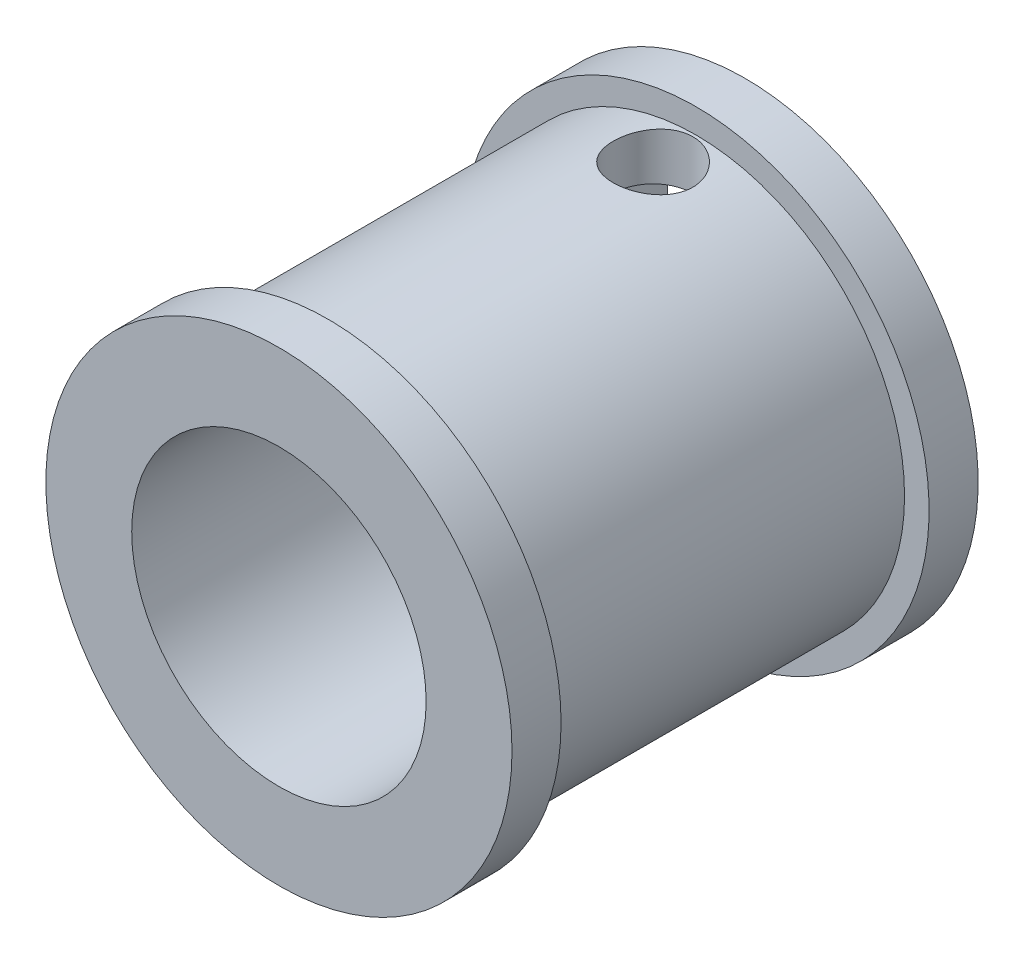
ISO-10303-21;
HEADER;
FILE_DESCRIPTION(('STEP AP214'),'2;1');
FILE_NAME('part.step','',(''),(''),'','','');
FILE_SCHEMA(('AUTOMOTIVE_DESIGN { 1 0 10303 214 1 1 1 1 }'));
ENDSEC;
DATA;
#1=APPLICATION_CONTEXT('core data for automotive mechanical design processes');
#2=APPLICATION_PROTOCOL_DEFINITION('international standard','automotive_design',2000,#1);
#3=PRODUCT_CONTEXT('',#1,'mechanical');
#4=PRODUCT('Part','Part','',(#3));
#5=PRODUCT_RELATED_PRODUCT_CATEGORY('part','',(#4));
#6=PRODUCT_DEFINITION_FORMATION('','',#4);
#7=PRODUCT_DEFINITION_CONTEXT('part definition',#1,'design');
#8=PRODUCT_DEFINITION('design','',#6,#7);
#9=PRODUCT_DEFINITION_SHAPE('','',#8);
#10=(LENGTH_UNIT() NAMED_UNIT(*) SI_UNIT(.MILLI.,.METRE.));
#11=(NAMED_UNIT(*) PLANE_ANGLE_UNIT() SI_UNIT($,.RADIAN.));
#12=(NAMED_UNIT(*) SI_UNIT($,.STERADIAN.) SOLID_ANGLE_UNIT());
#13=UNCERTAINTY_MEASURE_WITH_UNIT(LENGTH_MEASURE(1.E-05),#10,'distance_accuracy_value','');
#14=(GEOMETRIC_REPRESENTATION_CONTEXT(3) GLOBAL_UNCERTAINTY_ASSIGNED_CONTEXT((#13)) GLOBAL_UNIT_ASSIGNED_CONTEXT((#10,
#11,#12)) REPRESENTATION_CONTEXT('',''));
#15=CARTESIAN_POINT('',(0.,0.,0.));
#16=DIRECTION('',(0.,0.,1.));
#17=DIRECTION('',(1.,0.,0.));
#18=AXIS2_PLACEMENT_3D('',#15,#16,#17);
#19=CARTESIAN_POINT('',(0.,0.,19.));
#20=DIRECTION('',(0.,0.,-1.));
#21=DIRECTION('',(-1.,0.,0.));
#22=AXIS2_PLACEMENT_3D('',#19,#20,#21);
#23=CYLINDRICAL_SURFACE('',#22,1.625);
#24=CARTESIAN_POINT('',(0.,0.,3.75));
#25=DIRECTION('',(0.,-0.707106781186547,-0.707106781186547));
#26=DIRECTION('',(0.,0.707106781186547,-0.707106781186547));
#27=AXIS2_PLACEMENT_3D('',#24,#25,#26);
#28=ELLIPSE('',#27,2.29809703885628,1.625);
#29=CARTESIAN_POINT('',(-1.625,0.,3.75));
#30=VERTEX_POINT('',#29);
#31=CARTESIAN_POINT('',(-1.61264534228701,-0.2,3.95));
#32=VERTEX_POINT('',#31);
#33=EDGE_CURVE('E114',#30,#32,#28,.F.);
#34=ORIENTED_EDGE('',*,*,#33,.F.);
#35=CARTESIAN_POINT('',(0.,0.,3.75));
#36=DIRECTION('',(0.,0.707106781186547,-0.707106781186547));
#37=DIRECTION('',(0.,-0.707106781186547,-0.707106781186547));
#38=AXIS2_PLACEMENT_3D('',#35,#36,#37);
#39=ELLIPSE('',#38,2.29809703885628,1.625);
#40=CARTESIAN_POINT('',(1.625,0.,3.75));
#41=VERTEX_POINT('',#40);
#42=EDGE_CURVE('E110',#41,#30,#39,.F.);
#43=ORIENTED_EDGE('',*,*,#42,.F.);
#44=CARTESIAN_POINT('',(1.61264534228701,-0.2,3.95));
#45=VERTEX_POINT('',#44);
#46=EDGE_CURVE('E102',#45,#41,#28,.F.);
#47=ORIENTED_EDGE('',*,*,#46,.F.);
#48=DIRECTION('',(0.,0.,-1.));
#49=VECTOR('',#48,1.);
#50=CARTESIAN_POINT('',(1.61264534228701,-0.2,19.));
#51=LINE('',#50,#49);
#52=CARTESIAN_POINT('',(1.61264534228701,-0.2,3.55));
#53=VERTEX_POINT('',#52);
#54=EDGE_CURVE('E43',#45,#53,#51,.T.);
#55=ORIENTED_EDGE('',*,*,#54,.T.);
#56=CARTESIAN_POINT('',(0.,0.,3.75));
#57=DIRECTION('',(0.,0.707106781186547,-0.707106781186547));
#58=DIRECTION('',(0.,-0.707106781186547,-0.707106781186547));
#59=AXIS2_PLACEMENT_3D('',#56,#57,#58);
#60=ELLIPSE('',#59,2.29809703885628,1.625);
#61=EDGE_CURVE('E104',#41,#53,#60,.T.);
#62=ORIENTED_EDGE('',*,*,#61,.F.);
#63=CARTESIAN_POINT('',(0.,0.,3.75));
#64=DIRECTION('',(0.,-0.707106781186547,-0.707106781186547));
#65=DIRECTION('',(0.,0.707106781186547,-0.707106781186547));
#66=AXIS2_PLACEMENT_3D('',#63,#64,#65);
#67=ELLIPSE('',#66,2.29809703885628,1.625);
#68=EDGE_CURVE('E111',#30,#41,#67,.T.);
#69=ORIENTED_EDGE('',*,*,#68,.F.);
#70=CARTESIAN_POINT('',(-1.61264534228701,-0.2,3.55));
#71=VERTEX_POINT('',#70);
#72=EDGE_CURVE('E50',#71,#30,#60,.T.);
#73=ORIENTED_EDGE('',*,*,#72,.F.);
#74=DIRECTION('',(0.,0.,-1.));
#75=VECTOR('',#74,1.);
#76=CARTESIAN_POINT('',(-1.61264534228701,-0.2,19.));
#77=LINE('',#76,#75);
#78=EDGE_CURVE('E11',#71,#32,#77,.F.);
#79=ORIENTED_EDGE('',*,*,#78,.T.);
#80=EDGE_LOOP('',(#34,#43,#47,#55,#62,#69,#73,#79));
#81=FACE_BOUND('',#80,.T.);
#82=CARTESIAN_POINT('',(0.,0.,0.));
#83=DIRECTION('',(0.,0.,1.));
#84=DIRECTION('',(1.,0.,0.));
#85=AXIS2_PLACEMENT_3D('',#82,#83,#84);
#86=CIRCLE('',#85,1.625);
#87=CARTESIAN_POINT('',(1.625,0.,0.));
#88=VERTEX_POINT('',#87);
#89=EDGE_CURVE('E200',#88,#88,#86,.T.);
#90=ORIENTED_EDGE('',*,*,#89,.F.);
#91=EDGE_LOOP('',(#90));
#92=FACE_BOUND('',#91,.T.);
#93=CARTESIAN_POINT('',(0.,0.,10.));
#94=DIRECTION('',(0.,0.,1.));
#95=DIRECTION('',(1.,0.,0.));
#96=AXIS2_PLACEMENT_3D('',#93,#94,#95);
#97=CIRCLE('',#96,1.625);
#98=CARTESIAN_POINT('',(1.625,0.,10.));
#99=VERTEX_POINT('',#98);
#100=EDGE_CURVE('E38',#99,#99,#97,.F.);
#101=ORIENTED_EDGE('',*,*,#100,.F.);
#102=EDGE_LOOP('',(#101));
#103=FACE_BOUND('',#102,.T.);
#104=ADVANCED_FACE('F33',(#81,#92,#103),#23,.F.);
#105=CARTESIAN_POINT('',(0.,0.,19.));
#106=DIRECTION('',(0.,0.,-1.));
#107=DIRECTION('',(-1.,0.,0.));
#108=AXIS2_PLACEMENT_3D('',#105,#106,#107);
#109=CYLINDRICAL_SURFACE('',#108,8.5);
#110=CARTESIAN_POINT('',(0.,0.,2.));
#111=DIRECTION('',(0.,0.,-1.));
#112=DIRECTION('',(-1.,0.,0.));
#113=AXIS2_PLACEMENT_3D('',#110,#111,#112);
#114=CIRCLE('',#113,8.5);
#115=CARTESIAN_POINT('',(-8.5,0.,2.));
#116=VERTEX_POINT('',#115);
#117=EDGE_CURVE('E242',#116,#116,#114,.T.);
#118=ORIENTED_EDGE('',*,*,#117,.F.);
#119=EDGE_LOOP('',(#118));
#120=FACE_BOUND('',#119,.T.);
#121=CARTESIAN_POINT('',(0.,0.,17.));
#122=DIRECTION('',(0.,0.,1.));
#123=DIRECTION('',(1.,0.,0.));
#124=AXIS2_PLACEMENT_3D('',#121,#122,#123);
#125=CIRCLE('',#124,8.5);
#126=CARTESIAN_POINT('',(8.5,0.,17.));
#127=VERTEX_POINT('',#126);
#128=EDGE_CURVE('E97',#127,#127,#125,.T.);
#129=ORIENTED_EDGE('',*,*,#128,.F.);
#130=EDGE_LOOP('',(#129));
#131=FACE_BOUND('',#130,.T.);
#132=CARTESIAN_POINT('',(0.,8.5,5.375));
#133=CARTESIAN_POINT('',(0.0903945572538876,8.49999835243109,5.37499658149126));
#134=CARTESIAN_POINT('',(0.18083322350035,8.49854316497424,5.36743188876263));
#135=CARTESIAN_POINT('',(0.359159795109496,8.49287842275933,5.33739377851433));
#136=CARTESIAN_POINT('',(0.447045520844813,8.48866658268262,5.31490799090195));
#137=CARTESIAN_POINT('',(0.61766163173839,8.47795944255546,5.25574319233837));
#138=CARTESIAN_POINT('',(0.700396673362368,8.47146624131938,5.21907722380532));
#139=CARTESIAN_POINT('',(0.858533605572363,8.45690451266456,5.13263040235962));
#140=CARTESIAN_POINT('',(0.933936043768956,8.44883610302048,5.08285052984576));
#141=CARTESIAN_POINT('',(1.0762115101766,8.43190166548817,4.97093250788181));
#142=CARTESIAN_POINT('',(1.14298024738396,8.42302775850568,4.90866295749279));
#143=CARTESIAN_POINT('',(1.265190534391,8.40554061471071,4.77381579060993));
#144=CARTESIAN_POINT('',(1.32063125056873,8.3969273971219,4.70123741616192));
#145=CARTESIAN_POINT('',(1.41904843072196,8.3808601674157,4.5470920108507));
#146=CARTESIAN_POINT('',(1.4619182579635,8.37341630821173,4.46545574409331));
#147=CARTESIAN_POINT('',(1.53329395239523,8.36064189133733,4.29597353068678));
#148=CARTESIAN_POINT('',(1.56180110980798,8.35531114385172,4.20812814262207));
#149=CARTESIAN_POINT('',(1.60330642854418,8.34744594074392,4.02983899567812));
#150=CARTESIAN_POINT('',(1.61648678881636,8.34487866196381,3.93943912923692));
#151=CARTESIAN_POINT('',(1.62753001967958,8.3427321608315,3.75767745170205));
#152=CARTESIAN_POINT('',(1.62539431903934,8.34315265976247,3.66631573112951));
#153=CARTESIAN_POINT('',(1.60601366876019,8.34690433687137,3.48654750599075));
#154=CARTESIAN_POINT('',(1.58897638350366,8.35019550841473,3.39811765472527));
#155=CARTESIAN_POINT('',(1.54060344594839,8.35925481483431,3.22539498587627));
#156=CARTESIAN_POINT('',(1.50926716430382,8.36502305873398,3.1411023505661));
#157=CARTESIAN_POINT('',(1.43298405267585,8.37842813084279,2.97844189309478));
#158=CARTESIAN_POINT('',(1.38795381514222,8.38607635335706,2.90011416452897));
#159=CARTESIAN_POINT('',(1.2856199831973,8.40237214993443,2.75204841155908));
#160=CARTESIAN_POINT('',(1.22831509557011,8.4110198292527,2.68231129345321));
#161=CARTESIAN_POINT('',(1.10194123988146,8.42851419579409,2.55220695777682));
#162=CARTESIAN_POINT('',(1.03269475902188,8.43736182091324,2.49201215670377));
#163=CARTESIAN_POINT('',(0.88499618103328,8.45412897950981,2.38406683487531));
#164=CARTESIAN_POINT('',(0.806543984550195,8.46204850296872,2.33631644844601));
#165=CARTESIAN_POINT('',(0.642477737724025,8.47608409888518,2.25458814921088));
#166=CARTESIAN_POINT('',(0.556854280078011,8.48219775328289,2.22062867986473));
#167=CARTESIAN_POINT('',(0.38097510574662,8.49191418361371,2.16762325135386));
#168=CARTESIAN_POINT('',(0.290719902135103,8.49551723701261,2.14857564413613));
#169=CARTESIAN_POINT('',(0.109622114135444,8.49976823391624,2.1261758014087));
#170=CARTESIAN_POINT('',(0.018809749828459,8.50046063654033,2.12258741077682));
#171=CARTESIAN_POINT('',(-0.162117246503742,8.49893532218348,2.13057367090997));
#172=CARTESIAN_POINT('',(-0.25223191398799,8.49671775408556,2.14214754592698));
#173=CARTESIAN_POINT('',(-0.428452755980503,8.48964939137328,2.17993349679757));
#174=CARTESIAN_POINT('',(-0.514585598146657,8.48482018812363,2.20602559546225));
#175=CARTESIAN_POINT('',(-0.681254067551567,8.47306787307943,2.2719771354861));
#176=CARTESIAN_POINT('',(-0.761789302684263,8.46614461478012,2.31183754013441));
#177=CARTESIAN_POINT('',(-0.915980891342013,8.45086126981745,2.40471348330283));
#178=CARTESIAN_POINT('',(-0.989549140397992,8.44248581784409,2.45787271121178));
#179=CARTESIAN_POINT('',(-1.12680563036966,8.42526573618666,2.5756434586076));
#180=CARTESIAN_POINT('',(-1.19049290845354,8.4164210608926,2.64025609283648));
#181=CARTESIAN_POINT('',(-1.30708102478181,8.399111203794,2.78017039825303));
#182=CARTESIAN_POINT('',(-1.35982041980168,8.3906529663421,2.85560760098976));
#183=CARTESIAN_POINT('',(-1.45187917952133,8.37521549819557,3.01440915883489));
#184=CARTESIAN_POINT('',(-1.49119905477389,8.36823621123733,3.09777321220771));
#185=CARTESIAN_POINT('',(-1.55507616817908,8.35660182144951,3.2696600189125));
#186=CARTESIAN_POINT('',(-1.57970620665021,8.35193527686773,3.35815490709934));
#187=CARTESIAN_POINT('',(-1.61372797970122,8.34542912956261,3.53812487793951));
#188=CARTESIAN_POINT('',(-1.62312150978107,8.3435891937475,3.62959960814628));
#189=CARTESIAN_POINT('',(-1.62634169273169,8.34296194602857,3.81131443308119));
#190=CARTESIAN_POINT('',(-1.62042313014401,8.34412467096553,3.90154993808799));
#191=CARTESIAN_POINT('',(-1.59374624145851,8.34926070378568,4.07971428316511));
#192=CARTESIAN_POINT('',(-1.57298801248506,8.35323399327397,4.16764313832837));
#193=CARTESIAN_POINT('',(-1.51733033383493,8.36352204818264,4.33855393284873));
#194=CARTESIAN_POINT('',(-1.4824595280227,8.36983206862051,4.4215455042208));
#195=CARTESIAN_POINT('',(-1.39959479949044,8.38408576757389,4.58054066291797));
#196=CARTESIAN_POINT('',(-1.35159989918565,8.39202956777509,4.656543729121));
#197=CARTESIAN_POINT('',(-1.2429680791682,8.40881021672979,4.80067852256959));
#198=CARTESIAN_POINT('',(-1.18214614064919,8.41765903391513,4.86866943540694));
#199=CARTESIAN_POINT('',(-1.04997148708861,8.4351641981668,4.99356486630231));
#200=CARTESIAN_POINT('',(-0.978616356463049,8.44382050055824,5.05046683436179));
#201=CARTESIAN_POINT('',(-0.826595057873993,8.46006107011932,5.15207132625573));
#202=CARTESIAN_POINT('',(-0.745847538817393,8.46763447478637,5.19665392716147));
#203=CARTESIAN_POINT('',(-0.577888066767615,8.48074963995798,5.27154823399553));
#204=CARTESIAN_POINT('',(-0.490682202958104,8.48629328560504,5.30187318921524));
#205=CARTESIAN_POINT('',(-0.336030835981106,8.49360936379373,5.34131559546969));
#206=CARTESIAN_POINT('',(-0.269482836608206,8.49599217795871,5.35392539301356));
#207=CARTESIAN_POINT('',(-0.135298109376888,8.49918809133807,5.37076876082237));
#208=CARTESIAN_POINT('',(-0.067661411165921,8.50000123322511,5.37500255879483));
#209=CARTESIAN_POINT('',(0.,8.5,5.375));
#210=B_SPLINE_CURVE_WITH_KNOTS('',3,(#132,#133,#134,#135,#136,#137,#138,#139,#140,#141,#142,
#143,#144,#145,#146,#147,#148,#149,#150,#151,#152,#153,#154,#155,#156,#157,#158,#159,#160,#161,
#162,#163,#164,#165,#166,#167,#168,#169,#170,#171,#172,#173,#174,#175,#176,#177,#178,#179,#180,
#181,#182,#183,#184,#185,#186,#187,#188,#189,#190,#191,#192,#193,#194,#195,#196,#197,#198,#199,
#200,#201,#202,#203,#204,#205,#206,#207,#208,#209),.UNSPECIFIED.,.T.,.F.,(4,2,2,2,2,2,2,2,2,2,2,
2,2,2,2,2,2,2,2,2,2,2,2,2,2,2,2,2,2,2,2,2,2,2,2,2,2,2,4),(0.,0.270936205781262,
0.542097307937282,0.813009596787944,1.08390163791212,1.35780918645762,1.63173688443393,
1.9079251660624,2.1840886328117,2.45693448620097,2.72975488731821,2.99883284967365,
3.26792265617709,3.53868543374998,3.80947675202337,4.08470890002385,4.35994401878148,
4.63554602407514,4.91111756564415,5.18246420466136,5.45379696129436,5.7229200562965,
5.99206198410815,6.26424798646523,6.53646049481757,6.8124395539943,7.08840811222947,
7.36299740133278,7.63755432994534,7.90757227899994,8.1775884608257,8.44705932581407,
8.71655026856117,8.99023277903381,9.26397815108827,9.54030127403387,9.81636710644622,
10.0191716221483,10.2219706243892),.UNSPECIFIED.);
#211=CARTESIAN_POINT('',(0.,8.5,5.375));
#212=VERTEX_POINT('',#211);
#213=EDGE_CURVE('E121',#212,#212,#210,.T.);
#214=ORIENTED_EDGE('',*,*,#213,.F.);
#215=EDGE_LOOP('',(#214));
#216=FACE_BOUND('',#215,.T.);
#217=ADVANCED_FACE('F35',(#120,#131,#216),#109,.T.);
#218=CARTESIAN_POINT('',(0.,0.,19.));
#219=DIRECTION('',(0.,0.,1.));
#220=DIRECTION('',(1.,0.,0.));
#221=AXIS2_PLACEMENT_3D('',#218,#219,#220);
#222=PLANE('',#221);
#223=CARTESIAN_POINT('',(0.,0.,19.));
#224=DIRECTION('',(0.,0.,1.));
#225=DIRECTION('',(1.,0.,0.));
#226=AXIS2_PLACEMENT_3D('',#223,#224,#225);
#227=CIRCLE('',#226,6.);
#228=CARTESIAN_POINT('',(6.,0.,19.));
#229=VERTEX_POINT('',#228);
#230=EDGE_CURVE('E311',#229,#229,#227,.T.);
#231=ORIENTED_EDGE('',*,*,#230,.F.);
#232=EDGE_LOOP('',(#231));
#233=FACE_BOUND('',#232,.T.);
#234=CARTESIAN_POINT('',(0.,0.,19.));
#235=DIRECTION('',(0.,0.,1.));
#236=DIRECTION('',(1.,0.,0.));
#237=AXIS2_PLACEMENT_3D('',#234,#235,#236);
#238=CIRCLE('',#237,9.5);
#239=CARTESIAN_POINT('',(9.5,0.,19.));
#240=VERTEX_POINT('',#239);
#241=EDGE_CURVE('E123',#240,#240,#238,.T.);
#242=ORIENTED_EDGE('',*,*,#241,.T.);
#243=EDGE_LOOP('',(#242));
#244=FACE_BOUND('',#243,.T.);
#245=ADVANCED_FACE('F184',(#233,#244),#222,.T.);
#246=CARTESIAN_POINT('',(0.,0.,0.));
#247=DIRECTION('',(0.,0.,1.));
#248=DIRECTION('',(1.,0.,0.));
#249=AXIS2_PLACEMENT_3D('',#246,#247,#248);
#250=PLANE('',#249);
#251=DIRECTION('',(1.,0.,0.));
#252=VECTOR('',#251,1.);
#253=CARTESIAN_POINT('',(3.17,6.5,0.));
#254=LINE('',#253,#252);
#255=CARTESIAN_POINT('',(-3.17,6.5,0.));
#256=VERTEX_POINT('',#255);
#257=CARTESIAN_POINT('',(3.17,6.5,0.));
#258=VERTEX_POINT('',#257);
#259=EDGE_CURVE('E196',#256,#258,#254,.T.);
#260=ORIENTED_EDGE('',*,*,#259,.F.);
#261=DIRECTION('',(0.,1.,0.));
#262=VECTOR('',#261,1.);
#263=CARTESIAN_POINT('',(-3.17,3.5,0.));
#264=LINE('',#263,#262);
#265=CARTESIAN_POINT('',(-3.17,3.5,0.));
#266=VERTEX_POINT('',#265);
#267=EDGE_CURVE('E208',#266,#256,#264,.T.);
#268=ORIENTED_EDGE('',*,*,#267,.F.);
#269=DIRECTION('',(-1.,0.,0.));
#270=VECTOR('',#269,1.);
#271=CARTESIAN_POINT('',(3.17,3.5,0.));
#272=LINE('',#271,#270);
#273=CARTESIAN_POINT('',(3.17,3.5,0.));
#274=VERTEX_POINT('',#273);
#275=EDGE_CURVE('E216',#274,#266,#272,.T.);
#276=ORIENTED_EDGE('',*,*,#275,.F.);
#277=DIRECTION('',(0.,-1.,0.));
#278=VECTOR('',#277,1.);
#279=CARTESIAN_POINT('',(3.17,3.5,0.));
#280=LINE('',#279,#278);
#281=EDGE_CURVE('E228',#258,#274,#280,.T.);
#282=ORIENTED_EDGE('',*,*,#281,.F.);
#283=EDGE_LOOP('',(#260,#268,#276,#282));
#284=FACE_BOUND('',#283,.T.);
#285=ORIENTED_EDGE('',*,*,#89,.T.);
#286=EDGE_LOOP('',(#285));
#287=FACE_BOUND('',#286,.T.);
#288=CARTESIAN_POINT('',(0.,0.,0.));
#289=DIRECTION('',(0.,0.,-1.));
#290=DIRECTION('',(-1.,0.,0.));
#291=AXIS2_PLACEMENT_3D('',#288,#289,#290);
#292=CIRCLE('',#291,9.5);
#293=CARTESIAN_POINT('',(-9.5,0.,0.));
#294=VERTEX_POINT('',#293);
#295=EDGE_CURVE('E203',#294,#294,#292,.T.);
#296=ORIENTED_EDGE('',*,*,#295,.T.);
#297=EDGE_LOOP('',(#296));
#298=FACE_BOUND('',#297,.T.);
#299=ADVANCED_FACE('F180',(#284,#287,#298),#250,.F.);
#300=CARTESIAN_POINT('',(-3.17,3.5,7.5));
#301=DIRECTION('',(-1.,0.,0.));
#302=DIRECTION('',(0.,0.,1.));
#303=AXIS2_PLACEMENT_3D('',#300,#301,#302);
#304=PLANE('',#303);
#305=ORIENTED_EDGE('',*,*,#267,.T.);
#306=DIRECTION('',(0.,0.,-1.));
#307=VECTOR('',#306,1.);
#308=CARTESIAN_POINT('',(-3.17,6.5,7.5));
#309=LINE('',#308,#307);
#310=CARTESIAN_POINT('',(-3.17,6.5,7.5));
#311=VERTEX_POINT('',#310);
#312=EDGE_CURVE('E225',#311,#256,#309,.T.);
#313=ORIENTED_EDGE('',*,*,#312,.F.);
#314=DIRECTION('',(0.,1.,0.));
#315=VECTOR('',#314,1.);
#316=CARTESIAN_POINT('',(-3.17,3.5,7.5));
#317=LINE('',#316,#315);
#318=CARTESIAN_POINT('',(-3.17,3.5,7.5));
#319=VERTEX_POINT('',#318);
#320=EDGE_CURVE('E212',#319,#311,#317,.T.);
#321=ORIENTED_EDGE('',*,*,#320,.F.);
#322=DIRECTION('',(0.,0.,-1.));
#323=VECTOR('',#322,1.);
#324=CARTESIAN_POINT('',(-3.17,3.5,7.5));
#325=LINE('',#324,#323);
#326=EDGE_CURVE('E233',#319,#266,#325,.T.);
#327=ORIENTED_EDGE('',*,*,#326,.T.);
#328=EDGE_LOOP('',(#305,#313,#321,#327));
#329=FACE_BOUND('',#328,.T.);
#330=ADVANCED_FACE('F170',(#329),#304,.F.);
#331=CARTESIAN_POINT('',(3.17,3.5,7.5));
#332=DIRECTION('',(0.,-1.,0.));
#333=DIRECTION('',(0.,0.,-1.));
#334=AXIS2_PLACEMENT_3D('',#331,#332,#333);
#335=PLANE('',#334);
#336=CARTESIAN_POINT('',(0.,3.5,3.75));
#337=DIRECTION('',(0.,-1.,0.));
#338=DIRECTION('',(0.,0.,-1.));
#339=AXIS2_PLACEMENT_3D('',#336,#337,#338);
#340=CIRCLE('',#339,1.625);
#341=CARTESIAN_POINT('',(0.,3.5,2.125));
#342=VERTEX_POINT('',#341);
#343=EDGE_CURVE('E112',#342,#342,#340,.F.);
#344=ORIENTED_EDGE('',*,*,#343,.F.);
#345=EDGE_LOOP('',(#344));
#346=FACE_BOUND('',#345,.T.);
#347=ORIENTED_EDGE('',*,*,#275,.T.);
#348=ORIENTED_EDGE('',*,*,#326,.F.);
#349=DIRECTION('',(-1.,0.,0.));
#350=VECTOR('',#349,1.);
#351=CARTESIAN_POINT('',(3.17,3.5,7.5));
#352=LINE('',#351,#350);
#353=CARTESIAN_POINT('',(3.17,3.5,7.5));
#354=VERTEX_POINT('',#353);
#355=EDGE_CURVE('E222',#354,#319,#352,.T.);
#356=ORIENTED_EDGE('',*,*,#355,.F.);
#357=DIRECTION('',(0.,0.,-1.));
#358=VECTOR('',#357,1.);
#359=CARTESIAN_POINT('',(3.17,3.5,7.5));
#360=LINE('',#359,#358);
#361=EDGE_CURVE('E235',#354,#274,#360,.T.);
#362=ORIENTED_EDGE('',*,*,#361,.T.);
#363=EDGE_LOOP('',(#347,#348,#356,#362));
#364=FACE_BOUND('',#363,.T.);
#365=ADVANCED_FACE('F166',(#346,#364),#335,.F.);
#366=CARTESIAN_POINT('',(3.17,3.5,7.5));
#367=DIRECTION('',(1.,0.,0.));
#368=DIRECTION('',(0.,0.,-1.));
#369=AXIS2_PLACEMENT_3D('',#366,#367,#368);
#370=PLANE('',#369);
#371=ORIENTED_EDGE('',*,*,#281,.T.);
#372=ORIENTED_EDGE('',*,*,#361,.F.);
#373=DIRECTION('',(0.,-1.,0.));
#374=VECTOR('',#373,1.);
#375=CARTESIAN_POINT('',(3.17,3.5,7.5));
#376=LINE('',#375,#374);
#377=CARTESIAN_POINT('',(3.17,6.5,7.5));
#378=VERTEX_POINT('',#377);
#379=EDGE_CURVE('E219',#378,#354,#376,.T.);
#380=ORIENTED_EDGE('',*,*,#379,.F.);
#381=DIRECTION('',(0.,0.,-1.));
#382=VECTOR('',#381,1.);
#383=CARTESIAN_POINT('',(3.17,6.5,7.5));
#384=LINE('',#383,#382);
#385=EDGE_CURVE('E237',#378,#258,#384,.T.);
#386=ORIENTED_EDGE('',*,*,#385,.T.);
#387=EDGE_LOOP('',(#371,#372,#380,#386));
#388=FACE_BOUND('',#387,.T.);
#389=ADVANCED_FACE('F169',(#388),#370,.F.);
#390=CARTESIAN_POINT('',(3.17,6.5,7.5));
#391=DIRECTION('',(0.,1.,0.));
#392=DIRECTION('',(0.,0.,1.));
#393=AXIS2_PLACEMENT_3D('',#390,#391,#392);
#394=PLANE('',#393);
#395=CARTESIAN_POINT('',(0.,6.5,3.75));
#396=DIRECTION('',(0.,1.,0.));
#397=DIRECTION('',(0.,0.,1.));
#398=AXIS2_PLACEMENT_3D('',#395,#396,#397);
#399=CIRCLE('',#398,1.625);
#400=CARTESIAN_POINT('',(0.,6.5,5.375));
#401=VERTEX_POINT('',#400);
#402=EDGE_CURVE('E105',#401,#401,#399,.F.);
#403=ORIENTED_EDGE('',*,*,#402,.F.);
#404=EDGE_LOOP('',(#403));
#405=FACE_BOUND('',#404,.T.);
#406=ORIENTED_EDGE('',*,*,#259,.T.);
#407=ORIENTED_EDGE('',*,*,#385,.F.);
#408=DIRECTION('',(1.,0.,0.));
#409=VECTOR('',#408,1.);
#410=CARTESIAN_POINT('',(3.17,6.5,7.5));
#411=LINE('',#410,#409);
#412=EDGE_CURVE('E215',#311,#378,#411,.T.);
#413=ORIENTED_EDGE('',*,*,#412,.F.);
#414=ORIENTED_EDGE('',*,*,#312,.T.);
#415=EDGE_LOOP('',(#406,#407,#413,#414));
#416=FACE_BOUND('',#415,.T.);
#417=ADVANCED_FACE('F164',(#405,#416),#394,.F.);
#418=CARTESIAN_POINT('',(0.,0.,7.5));
#419=DIRECTION('',(0.,0.,1.));
#420=DIRECTION('',(1.,0.,0.));
#421=AXIS2_PLACEMENT_3D('',#418,#419,#420);
#422=PLANE('',#421);
#423=ORIENTED_EDGE('',*,*,#320,.T.);
#424=ORIENTED_EDGE('',*,*,#412,.T.);
#425=ORIENTED_EDGE('',*,*,#379,.T.);
#426=ORIENTED_EDGE('',*,*,#355,.T.);
#427=EDGE_LOOP('',(#423,#424,#425,#426));
#428=FACE_BOUND('',#427,.T.);
#429=ADVANCED_FACE('F160',(#428),#422,.F.);
#430=CARTESIAN_POINT('',(0.,0.,2.));
#431=DIRECTION('',(0.,0.,-1.));
#432=DIRECTION('',(-1.,0.,0.));
#433=AXIS2_PLACEMENT_3D('',#430,#431,#432);
#434=CYLINDRICAL_SURFACE('',#433,9.5);
#435=CARTESIAN_POINT('',(0.,0.,2.));
#436=DIRECTION('',(0.,0.,-1.));
#437=DIRECTION('',(-1.,0.,0.));
#438=AXIS2_PLACEMENT_3D('',#435,#436,#437);
#439=CIRCLE('',#438,9.5);
#440=CARTESIAN_POINT('',(-9.5,0.,2.));
#441=VERTEX_POINT('',#440);
#442=EDGE_CURVE('E205',#441,#441,#439,.T.);
#443=ORIENTED_EDGE('',*,*,#442,.T.);
#444=EDGE_LOOP('',(#443));
#445=FACE_BOUND('',#444,.T.);
#446=ORIENTED_EDGE('',*,*,#295,.F.);
#447=EDGE_LOOP('',(#446));
#448=FACE_BOUND('',#447,.T.);
#449=ADVANCED_FACE('F156',(#445,#448),#434,.T.);
#450=CARTESIAN_POINT('',(0.,0.,2.));
#451=DIRECTION('',(0.,0.,-1.));
#452=DIRECTION('',(-1.,0.,0.));
#453=AXIS2_PLACEMENT_3D('',#450,#451,#452);
#454=PLANE('',#453);
#455=ORIENTED_EDGE('',*,*,#117,.T.);
#456=EDGE_LOOP('',(#455));
#457=FACE_BOUND('',#456,.T.);
#458=ORIENTED_EDGE('',*,*,#442,.F.);
#459=EDGE_LOOP('',(#458));
#460=FACE_BOUND('',#459,.T.);
#461=ADVANCED_FACE('F152',(#457,#460),#454,.F.);
#462=CARTESIAN_POINT('',(0.,0.,17.));
#463=DIRECTION('',(0.,0.,1.));
#464=DIRECTION('',(1.,0.,0.));
#465=AXIS2_PLACEMENT_3D('',#462,#463,#464);
#466=CYLINDRICAL_SURFACE('',#465,9.5);
#467=CARTESIAN_POINT('',(0.,0.,17.));
#468=DIRECTION('',(0.,0.,1.));
#469=DIRECTION('',(1.,0.,0.));
#470=AXIS2_PLACEMENT_3D('',#467,#468,#469);
#471=CIRCLE('',#470,9.5);
#472=CARTESIAN_POINT('',(9.5,0.,17.));
#473=VERTEX_POINT('',#472);
#474=EDGE_CURVE('E128',#473,#473,#471,.T.);
#475=ORIENTED_EDGE('',*,*,#474,.T.);
#476=EDGE_LOOP('',(#475));
#477=FACE_BOUND('',#476,.T.);
#478=ORIENTED_EDGE('',*,*,#241,.F.);
#479=EDGE_LOOP('',(#478));
#480=FACE_BOUND('',#479,.T.);
#481=ADVANCED_FACE('F148',(#477,#480),#466,.T.);
#482=CARTESIAN_POINT('',(0.,0.,17.));
#483=DIRECTION('',(0.,0.,1.));
#484=DIRECTION('',(1.,0.,0.));
#485=AXIS2_PLACEMENT_3D('',#482,#483,#484);
#486=PLANE('',#485);
#487=ORIENTED_EDGE('',*,*,#128,.T.);
#488=EDGE_LOOP('',(#487));
#489=FACE_BOUND('',#488,.T.);
#490=ORIENTED_EDGE('',*,*,#474,.F.);
#491=EDGE_LOOP('',(#490));
#492=FACE_BOUND('',#491,.T.);
#493=ADVANCED_FACE('F141',(#489,#492),#486,.F.);
#494=CARTESIAN_POINT('',(0.,-0.2,3.75));
#495=DIRECTION('',(0.,1.,0.));
#496=DIRECTION('',(0.,0.,1.));
#497=AXIS2_PLACEMENT_3D('',#494,#495,#496);
#498=CYLINDRICAL_SURFACE('',#497,1.625);
#499=ORIENTED_EDGE('',*,*,#402,.T.);
#500=EDGE_LOOP('',(#499));
#501=FACE_BOUND('',#500,.T.);
#502=ORIENTED_EDGE('',*,*,#213,.T.);
#503=EDGE_LOOP('',(#502));
#504=FACE_BOUND('',#503,.T.);
#505=ADVANCED_FACE('F135',(#501,#504),#498,.F.);
#506=ORIENTED_EDGE('',*,*,#343,.T.);
#507=EDGE_LOOP('',(#506));
#508=FACE_BOUND('',#507,.T.);
#509=ORIENTED_EDGE('',*,*,#42,.T.);
#510=ORIENTED_EDGE('',*,*,#68,.T.);
#511=EDGE_LOOP('',(#509,#510));
#512=FACE_BOUND('',#511,.T.);
#513=ADVANCED_FACE('F140',(#508,#512),#498,.F.);
#514=CARTESIAN_POINT('',(0.,-0.2,3.75));
#515=DIRECTION('',(0.,-1.,0.));
#516=DIRECTION('',(0.,0.,-1.));
#517=AXIS2_PLACEMENT_3D('',#514,#515,#516);
#518=PLANE('',#517);
#519=CARTESIAN_POINT('',(0.,-0.2,3.75));
#520=DIRECTION('',(0.,-1.,0.));
#521=DIRECTION('',(0.,0.,-1.));
#522=AXIS2_PLACEMENT_3D('',#519,#520,#521);
#523=CIRCLE('',#522,1.625);
#524=EDGE_CURVE('E57',#53,#45,#523,.T.);
#525=ORIENTED_EDGE('',*,*,#524,.F.);
#526=ORIENTED_EDGE('',*,*,#54,.F.);
#527=EDGE_LOOP('',(#525,#526));
#528=FACE_BOUND('',#527,.T.);
#529=ADVANCED_FACE('F93',(#528),#518,.F.);
#530=ORIENTED_EDGE('',*,*,#61,.T.);
#531=ORIENTED_EDGE('',*,*,#524,.T.);
#532=ORIENTED_EDGE('',*,*,#46,.T.);
#533=EDGE_LOOP('',(#530,#531,#532));
#534=FACE_BOUND('',#533,.T.);
#535=ADVANCED_FACE('F101',(#534),#498,.F.);
#536=EDGE_CURVE('E106',#32,#71,#523,.T.);
#537=ORIENTED_EDGE('',*,*,#536,.F.);
#538=ORIENTED_EDGE('',*,*,#78,.F.);
#539=EDGE_LOOP('',(#537,#538));
#540=FACE_BOUND('',#539,.T.);
#541=ADVANCED_FACE('F144',(#540),#518,.F.);
#542=ORIENTED_EDGE('',*,*,#33,.T.);
#543=ORIENTED_EDGE('',*,*,#536,.T.);
#544=ORIENTED_EDGE('',*,*,#72,.T.);
#545=EDGE_LOOP('',(#542,#543,#544));
#546=FACE_BOUND('',#545,.T.);
#547=ADVANCED_FACE('F143',(#546),#498,.F.);
#548=CARTESIAN_POINT('',(0.,0.,10.));
#549=DIRECTION('',(0.,0.,1.));
#550=DIRECTION('',(1.,0.,0.));
#551=AXIS2_PLACEMENT_3D('',#548,#549,#550);
#552=PLANE('',#551);
#553=CARTESIAN_POINT('',(0.,0.,10.));
#554=DIRECTION('',(0.,0.,1.));
#555=DIRECTION('',(1.,0.,0.));
#556=AXIS2_PLACEMENT_3D('',#553,#554,#555);
#557=CIRCLE('',#556,6.);
#558=CARTESIAN_POINT('',(6.,0.,10.));
#559=VERTEX_POINT('',#558);
#560=EDGE_CURVE('E308',#559,#559,#557,.T.);
#561=ORIENTED_EDGE('',*,*,#560,.T.);
#562=EDGE_LOOP('',(#561));
#563=FACE_BOUND('',#562,.T.);
#564=ORIENTED_EDGE('',*,*,#100,.T.);
#565=EDGE_LOOP('',(#564));
#566=FACE_BOUND('',#565,.T.);
#567=ADVANCED_FACE('F286',(#563,#566),#552,.T.);
#568=CARTESIAN_POINT('',(0.,0.,10.));
#569=DIRECTION('',(0.,0.,1.));
#570=DIRECTION('',(1.,0.,0.));
#571=AXIS2_PLACEMENT_3D('',#568,#569,#570);
#572=CYLINDRICAL_SURFACE('',#571,6.);
#573=ORIENTED_EDGE('',*,*,#560,.F.);
#574=EDGE_LOOP('',(#573));
#575=FACE_BOUND('',#574,.T.);
#576=ORIENTED_EDGE('',*,*,#230,.T.);
#577=EDGE_LOOP('',(#576));
#578=FACE_BOUND('',#577,.T.);
#579=ADVANCED_FACE('F291',(#575,#578),#572,.F.);
#580=CLOSED_SHELL('',(#104,#217,#245,#299,#330,#365,#389,#417,#429,#449,#461,#481,#493,#505,
#513,#529,#535,#541,#547,#567,#579));
#581=MANIFOLD_SOLID_BREP('B2',#580);
#582=ADVANCED_BREP_SHAPE_REPRESENTATION('',(#18,#581),#14);
#583=SHAPE_DEFINITION_REPRESENTATION(#9,#582);
ENDSEC;
END-ISO-10303-21;
